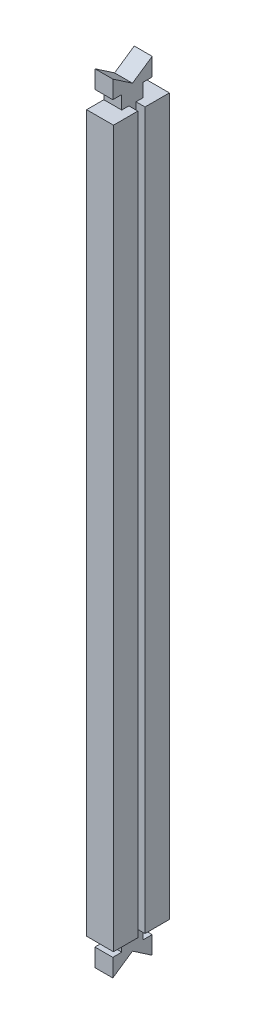
ISO-10303-21;
HEADER;
FILE_DESCRIPTION(('STEP AP214'),'2;1');
FILE_NAME('part.step','',(''),(''),'','','');
FILE_SCHEMA(('AUTOMOTIVE_DESIGN { 1 0 10303 214 1 1 1 1 }'));
ENDSEC;
DATA;
#1=APPLICATION_CONTEXT('core data for automotive mechanical design processes');
#2=APPLICATION_PROTOCOL_DEFINITION('international standard','automotive_design',2000,#1);
#3=PRODUCT_CONTEXT('',#1,'mechanical');
#4=PRODUCT('Part','Part','',(#3));
#5=PRODUCT_RELATED_PRODUCT_CATEGORY('part','',(#4));
#6=PRODUCT_DEFINITION_FORMATION('','',#4);
#7=PRODUCT_DEFINITION_CONTEXT('part definition',#1,'design');
#8=PRODUCT_DEFINITION('design','',#6,#7);
#9=PRODUCT_DEFINITION_SHAPE('','',#8);
#10=(LENGTH_UNIT() NAMED_UNIT(*) SI_UNIT(.MILLI.,.METRE.));
#11=(NAMED_UNIT(*) PLANE_ANGLE_UNIT() SI_UNIT($,.RADIAN.));
#12=(NAMED_UNIT(*) SI_UNIT($,.STERADIAN.) SOLID_ANGLE_UNIT());
#13=UNCERTAINTY_MEASURE_WITH_UNIT(LENGTH_MEASURE(1.E-05),#10,'distance_accuracy_value','');
#14=(GEOMETRIC_REPRESENTATION_CONTEXT(3) GLOBAL_UNCERTAINTY_ASSIGNED_CONTEXT((#13)) GLOBAL_UNIT_ASSIGNED_CONTEXT((#10,
#11,#12)) REPRESENTATION_CONTEXT('',''));
#15=CARTESIAN_POINT('',(0.,0.,0.));
#16=DIRECTION('',(0.,0.,1.));
#17=DIRECTION('',(1.,0.,0.));
#18=AXIS2_PLACEMENT_3D('',#15,#16,#17);
#19=CARTESIAN_POINT('',(0.,0.,0.));
#20=DIRECTION('',(1.,0.,0.));
#21=DIRECTION('',(0.,0.,-1.));
#22=AXIS2_PLACEMENT_3D('',#19,#20,#21);
#23=PLANE('',#22);
#24=DIRECTION('',(0.,0.563336824641511,0.826227342807547));
#25=VECTOR('',#24,1.);
#26=CARTESIAN_POINT('',(0.,6.98500000000001,-5.58799999999999));
#27=LINE('',#26,#25);
#28=CARTESIAN_POINT('',(0.,6.98500000000001,-5.58799999999999));
#29=VERTEX_POINT('',#28);
#30=CARTESIAN_POINT('',(0.,10.795,0.));
#31=VERTEX_POINT('',#30);
#32=EDGE_CURVE('E417',#29,#31,#27,.T.);
#33=ORIENTED_EDGE('',*,*,#32,.T.);
#34=DIRECTION('',(0.,0.563336824641511,-0.826227342807547));
#35=VECTOR('',#34,1.);
#36=CARTESIAN_POINT('',(0.,7.36922425952045,5.02447108603668));
#37=LINE('',#36,#35);
#38=CARTESIAN_POINT('',(0.,6.98500000000001,5.58799999999999));
#39=VERTEX_POINT('',#38);
#40=EDGE_CURVE('E498',#39,#31,#37,.T.);
#41=ORIENTED_EDGE('',*,*,#40,.F.);
#42=DIRECTION('',(0.,-1.,0.));
#43=VECTOR('',#42,1.);
#44=CARTESIAN_POINT('',(0.,0.,5.58799999999999));
#45=LINE('',#44,#43);
#46=CARTESIAN_POINT('',(0.,12.065,5.58799999999999));
#47=VERTEX_POINT('',#46);
#48=EDGE_CURVE('E495',#47,#39,#45,.T.);
#49=ORIENTED_EDGE('',*,*,#48,.F.);
#50=DIRECTION('',(0.,0.,1.));
#51=VECTOR('',#50,1.);
#52=CARTESIAN_POINT('',(0.,12.065,0.));
#53=LINE('',#52,#51);
#54=CARTESIAN_POINT('',(0.,12.065,3.04799999999999));
#55=VERTEX_POINT('',#54);
#56=EDGE_CURVE('E492',#55,#47,#53,.T.);
#57=ORIENTED_EDGE('',*,*,#56,.F.);
#58=DIRECTION('',(0.,-1.,0.));
#59=VECTOR('',#58,1.);
#60=CARTESIAN_POINT('',(0.,0.,3.04799999999999));
#61=LINE('',#60,#59);
#62=CARTESIAN_POINT('',(0.,15.875,3.04799999999999));
#63=VERTEX_POINT('',#62);
#64=EDGE_CURVE('E489',#63,#55,#61,.T.);
#65=ORIENTED_EDGE('',*,*,#64,.F.);
#66=DIRECTION('',(0.,0.,1.));
#67=VECTOR('',#66,1.);
#68=CARTESIAN_POINT('',(0.,15.875,0.));
#69=LINE('',#68,#67);
#70=CARTESIAN_POINT('',(0.,15.875,7.93749999999999));
#71=VERTEX_POINT('',#70);
#72=EDGE_CURVE('E485',#63,#71,#69,.T.);
#73=ORIENTED_EDGE('',*,*,#72,.T.);
#74=DIRECTION('',(0.,1.,0.));
#75=VECTOR('',#74,1.);
#76=CARTESIAN_POINT('',(0.,0.,7.93749999999999));
#77=LINE('',#76,#75);
#78=CARTESIAN_POINT('',(0.,219.075,7.93749999999999));
#79=VERTEX_POINT('',#78);
#80=EDGE_CURVE('E481',#71,#79,#77,.T.);
#81=ORIENTED_EDGE('',*,*,#80,.T.);
#82=DIRECTION('',(0.,0.,1.));
#83=VECTOR('',#82,1.);
#84=CARTESIAN_POINT('',(0.,219.075,-1.24359397238857E-12));
#85=LINE('',#84,#83);
#86=CARTESIAN_POINT('',(0.,219.075,3.04799999999999));
#87=VERTEX_POINT('',#86);
#88=EDGE_CURVE('E477',#87,#79,#85,.T.);
#89=ORIENTED_EDGE('',*,*,#88,.F.);
#90=DIRECTION('',(0.,1.,0.));
#91=VECTOR('',#90,1.);
#92=CARTESIAN_POINT('',(0.,0.,3.04799999999999));
#93=LINE('',#92,#91);
#94=CARTESIAN_POINT('',(0.,222.885,3.04799999999999));
#95=VERTEX_POINT('',#94);
#96=EDGE_CURVE('E473',#87,#95,#93,.T.);
#97=ORIENTED_EDGE('',*,*,#96,.T.);
#98=DIRECTION('',(0.,0.,1.));
#99=VECTOR('',#98,1.);
#100=CARTESIAN_POINT('',(0.,222.885,0.));
#101=LINE('',#100,#99);
#102=CARTESIAN_POINT('',(0.,222.885,5.58799999999999));
#103=VERTEX_POINT('',#102);
#104=EDGE_CURVE('E469',#95,#103,#101,.T.);
#105=ORIENTED_EDGE('',*,*,#104,.T.);
#106=DIRECTION('',(0.,1.,0.));
#107=VECTOR('',#106,1.);
#108=CARTESIAN_POINT('',(0.,0.,5.58799999999999));
#109=LINE('',#108,#107);
#110=CARTESIAN_POINT('',(0.,227.965,5.58799999999999));
#111=VERTEX_POINT('',#110);
#112=EDGE_CURVE('E465',#103,#111,#109,.T.);
#113=ORIENTED_EDGE('',*,*,#112,.T.);
#114=DIRECTION('',(0.,-0.563336824641514,-0.826227342807545));
#115=VECTOR('',#114,1.);
#116=CARTESIAN_POINT('',(0.,153.019774330041,-104.331664315938));
#117=LINE('',#116,#115);
#118=CARTESIAN_POINT('',(0.,224.155,0.));
#119=VERTEX_POINT('',#118);
#120=EDGE_CURVE('E461',#111,#119,#117,.T.);
#121=ORIENTED_EDGE('',*,*,#120,.T.);
#122=DIRECTION('',(0.,-0.563336824641514,0.826227342807545));
#123=VECTOR('',#122,1.);
#124=CARTESIAN_POINT('',(0.,153.019774330041,104.331664315938));
#125=LINE('',#124,#123);
#126=CARTESIAN_POINT('',(0.,227.965,-5.58799999999997));
#127=VERTEX_POINT('',#126);
#128=EDGE_CURVE('E423',#127,#119,#125,.T.);
#129=ORIENTED_EDGE('',*,*,#128,.F.);
#130=DIRECTION('',(0.,1.,0.));
#131=VECTOR('',#130,1.);
#132=CARTESIAN_POINT('',(0.,0.,-5.58799999999999));
#133=LINE('',#132,#131);
#134=CARTESIAN_POINT('',(0.,222.885,-5.58799999999999));
#135=VERTEX_POINT('',#134);
#136=EDGE_CURVE('E516',#135,#127,#133,.T.);
#137=ORIENTED_EDGE('',*,*,#136,.F.);
#138=DIRECTION('',(0.,0.,-1.));
#139=VECTOR('',#138,1.);
#140=CARTESIAN_POINT('',(0.,222.885,0.));
#141=LINE('',#140,#139);
#142=CARTESIAN_POINT('',(0.,222.885,-3.04799999999999));
#143=VERTEX_POINT('',#142);
#144=EDGE_CURVE('E513',#143,#135,#141,.T.);
#145=ORIENTED_EDGE('',*,*,#144,.F.);
#146=DIRECTION('',(0.,1.,0.));
#147=VECTOR('',#146,1.);
#148=CARTESIAN_POINT('',(0.,0.,-3.04799999999999));
#149=LINE('',#148,#147);
#150=CARTESIAN_POINT('',(0.,219.075,-3.04799999999999));
#151=VERTEX_POINT('',#150);
#152=EDGE_CURVE('E510',#151,#143,#149,.T.);
#153=ORIENTED_EDGE('',*,*,#152,.F.);
#154=DIRECTION('',(0.,0.,-1.));
#155=VECTOR('',#154,1.);
#156=CARTESIAN_POINT('',(0.,219.075,1.24359397238857E-12));
#157=LINE('',#156,#155);
#158=CARTESIAN_POINT('',(0.,219.075,-7.93749999999999));
#159=VERTEX_POINT('',#158);
#160=EDGE_CURVE('E506',#151,#159,#157,.T.);
#161=ORIENTED_EDGE('',*,*,#160,.T.);
#162=DIRECTION('',(0.,1.,0.));
#163=VECTOR('',#162,1.);
#164=CARTESIAN_POINT('',(0.,0.,-7.93749999999999));
#165=LINE('',#164,#163);
#166=CARTESIAN_POINT('',(0.,15.875,-7.93749999999999));
#167=VERTEX_POINT('',#166);
#168=EDGE_CURVE('E502',#167,#159,#165,.T.);
#169=ORIENTED_EDGE('',*,*,#168,.F.);
#170=DIRECTION('',(0.,0.,-1.));
#171=VECTOR('',#170,1.);
#172=CARTESIAN_POINT('',(0.,15.875,-3.04799999999999));
#173=LINE('',#172,#171);
#174=CARTESIAN_POINT('',(0.,15.875,-3.04799999999999));
#175=VERTEX_POINT('',#174);
#176=EDGE_CURVE('E579',#175,#167,#173,.T.);
#177=ORIENTED_EDGE('',*,*,#176,.F.);
#178=DIRECTION('',(0.,-1.,0.));
#179=VECTOR('',#178,1.);
#180=CARTESIAN_POINT('',(0.,15.875,-3.04799999999999));
#181=LINE('',#180,#179);
#182=CARTESIAN_POINT('',(0.,12.065,-3.04799999999999));
#183=VERTEX_POINT('',#182);
#184=EDGE_CURVE('E603',#175,#183,#181,.T.);
#185=ORIENTED_EDGE('',*,*,#184,.T.);
#186=DIRECTION('',(0.,0.,-1.));
#187=VECTOR('',#186,1.);
#188=CARTESIAN_POINT('',(0.,12.065,-3.04799999999999));
#189=LINE('',#188,#187);
#190=CARTESIAN_POINT('',(0.,12.065,-5.58799999999999));
#191=VERTEX_POINT('',#190);
#192=EDGE_CURVE('E599',#183,#191,#189,.T.);
#193=ORIENTED_EDGE('',*,*,#192,.T.);
#194=DIRECTION('',(0.,-1.,0.));
#195=VECTOR('',#194,1.);
#196=CARTESIAN_POINT('',(0.,12.065,-5.58799999999999));
#197=LINE('',#196,#195);
#198=EDGE_CURVE('E595',#191,#29,#197,.T.);
#199=ORIENTED_EDGE('',*,*,#198,.T.);
#200=EDGE_LOOP('',(#33,#41,#49,#57,#65,#73,#81,#89,#97,#105,#113,#121,#129,#137,#145,#153,#161,
#169,#177,#185,#193,#199));
#201=FACE_BOUND('',#200,.T.);
#202=ADVANCED_FACE('F170',(#201),#23,.F.);
#203=CARTESIAN_POINT('',(5.08,0.,5.58799999999999));
#204=DIRECTION('',(0.,0.,-1.));
#205=DIRECTION('',(-1.,0.,0.));
#206=AXIS2_PLACEMENT_3D('',#203,#204,#205);
#207=PLANE('',#206);
#208=ORIENTED_EDGE('',*,*,#48,.T.);
#209=DIRECTION('',(-1.,0.,0.));
#210=VECTOR('',#209,1.);
#211=CARTESIAN_POINT('',(5.08,6.98500000000001,5.58799999999999));
#212=LINE('',#211,#210);
#213=CARTESIAN_POINT('',(5.08,6.98500000000001,5.58799999999999));
#214=VERTEX_POINT('',#213);
#215=EDGE_CURVE('E545',#214,#39,#212,.T.);
#216=ORIENTED_EDGE('',*,*,#215,.F.);
#217=DIRECTION('',(0.,-1.,0.));
#218=VECTOR('',#217,1.);
#219=CARTESIAN_POINT('',(5.08,0.,5.58799999999999));
#220=LINE('',#219,#218);
#221=CARTESIAN_POINT('',(5.08,12.065,5.58799999999999));
#222=VERTEX_POINT('',#221);
#223=EDGE_CURVE('E441',#222,#214,#220,.T.);
#224=ORIENTED_EDGE('',*,*,#223,.F.);
#225=DIRECTION('',(-1.,0.,0.));
#226=VECTOR('',#225,1.);
#227=CARTESIAN_POINT('',(5.08,12.065,5.58799999999999));
#228=LINE('',#227,#226);
#229=EDGE_CURVE('E549',#222,#47,#228,.T.);
#230=ORIENTED_EDGE('',*,*,#229,.T.);
#231=EDGE_LOOP('',(#208,#216,#224,#230));
#232=FACE_BOUND('',#231,.T.);
#233=ADVANCED_FACE('F714',(#232),#207,.F.);
#234=CARTESIAN_POINT('',(5.08,12.065,0.));
#235=DIRECTION('',(0.,-1.,0.));
#236=DIRECTION('',(0.,0.,-1.));
#237=AXIS2_PLACEMENT_3D('',#234,#235,#236);
#238=PLANE('',#237);
#239=ORIENTED_EDGE('',*,*,#56,.T.);
#240=ORIENTED_EDGE('',*,*,#229,.F.);
#241=DIRECTION('',(0.,0.,1.));
#242=VECTOR('',#241,1.);
#243=CARTESIAN_POINT('',(5.08,12.065,0.));
#244=LINE('',#243,#242);
#245=CARTESIAN_POINT('',(5.08,12.065,3.04799999999999));
#246=VERTEX_POINT('',#245);
#247=EDGE_CURVE('E438',#246,#222,#244,.T.);
#248=ORIENTED_EDGE('',*,*,#247,.F.);
#249=DIRECTION('',(-1.,0.,0.));
#250=VECTOR('',#249,1.);
#251=CARTESIAN_POINT('',(5.08,12.065,3.04799999999999));
#252=LINE('',#251,#250);
#253=EDGE_CURVE('E553',#246,#55,#252,.T.);
#254=ORIENTED_EDGE('',*,*,#253,.T.);
#255=EDGE_LOOP('',(#239,#240,#248,#254));
#256=FACE_BOUND('',#255,.T.);
#257=ADVANCED_FACE('F709',(#256),#238,.F.);
#258=CARTESIAN_POINT('',(5.08,0.,3.04799999999999));
#259=DIRECTION('',(0.,0.,-1.));
#260=DIRECTION('',(-1.,0.,0.));
#261=AXIS2_PLACEMENT_3D('',#258,#259,#260);
#262=PLANE('',#261);
#263=ORIENTED_EDGE('',*,*,#64,.T.);
#264=ORIENTED_EDGE('',*,*,#253,.F.);
#265=DIRECTION('',(0.,-1.,0.));
#266=VECTOR('',#265,1.);
#267=CARTESIAN_POINT('',(5.08,0.,3.04799999999999));
#268=LINE('',#267,#266);
#269=CARTESIAN_POINT('',(5.08,15.875,3.04799999999999));
#270=VERTEX_POINT('',#269);
#271=EDGE_CURVE('E435',#270,#246,#268,.T.);
#272=ORIENTED_EDGE('',*,*,#271,.F.);
#273=DIRECTION('',(-1.,0.,0.));
#274=VECTOR('',#273,1.);
#275=CARTESIAN_POINT('',(5.08,15.875,3.04799999999999));
#276=LINE('',#275,#274);
#277=EDGE_CURVE('E557',#270,#63,#276,.T.);
#278=ORIENTED_EDGE('',*,*,#277,.T.);
#279=EDGE_LOOP('',(#263,#264,#272,#278));
#280=FACE_BOUND('',#279,.T.);
#281=ADVANCED_FACE('F704',(#280),#262,.F.);
#282=CARTESIAN_POINT('',(5.08,15.875,0.));
#283=DIRECTION('',(0.,-1.,0.));
#284=DIRECTION('',(0.,0.,-1.));
#285=AXIS2_PLACEMENT_3D('',#282,#283,#284);
#286=PLANE('',#285);
#287=ORIENTED_EDGE('',*,*,#72,.F.);
#288=ORIENTED_EDGE('',*,*,#277,.F.);
#289=DIRECTION('',(0.,0.,1.));
#290=VECTOR('',#289,1.);
#291=CARTESIAN_POINT('',(5.08,15.875,0.));
#292=LINE('',#291,#290);
#293=CARTESIAN_POINT('',(5.08,15.875,1.016));
#294=VERTEX_POINT('',#293);
#295=EDGE_CURVE('E354',#294,#270,#292,.T.);
#296=ORIENTED_EDGE('',*,*,#295,.F.);
#297=DIRECTION('',(-1.,0.,0.));
#298=VECTOR('',#297,1.);
#299=CARTESIAN_POINT('',(7.62,15.875,1.016));
#300=LINE('',#299,#298);
#301=CARTESIAN_POINT('',(7.62,15.875,1.016));
#302=VERTEX_POINT('',#301);
#303=EDGE_CURVE('E414',#302,#294,#300,.T.);
#304=ORIENTED_EDGE('',*,*,#303,.F.);
#305=DIRECTION('',(0.,0.,1.));
#306=VECTOR('',#305,1.);
#307=CARTESIAN_POINT('',(7.62,15.875,0.));
#308=LINE('',#307,#306);
#309=CARTESIAN_POINT('',(7.62,15.875,7.93749999999999));
#310=VERTEX_POINT('',#309);
#311=EDGE_CURVE('E390',#302,#310,#308,.T.);
#312=ORIENTED_EDGE('',*,*,#311,.T.);
#313=DIRECTION('',(-1.,0.,0.));
#314=VECTOR('',#313,1.);
#315=CARTESIAN_POINT('',(5.08,15.875,7.93749999999999));
#316=LINE('',#315,#314);
#317=EDGE_CURVE('E560',#310,#71,#316,.T.);
#318=ORIENTED_EDGE('',*,*,#317,.T.);
#319=EDGE_LOOP('',(#287,#288,#296,#304,#312,#318));
#320=FACE_BOUND('',#319,.T.);
#321=ADVANCED_FACE('F702',(#320),#286,.T.);
#322=CARTESIAN_POINT('',(5.08,0.,7.93749999999999));
#323=DIRECTION('',(0.,0.,1.));
#324=DIRECTION('',(1.,0.,0.));
#325=AXIS2_PLACEMENT_3D('',#322,#323,#324);
#326=PLANE('',#325);
#327=ORIENTED_EDGE('',*,*,#80,.F.);
#328=ORIENTED_EDGE('',*,*,#317,.F.);
#329=DIRECTION('',(0.,-1.,0.));
#330=VECTOR('',#329,1.);
#331=CARTESIAN_POINT('',(7.62,0.,7.93749999999999));
#332=LINE('',#331,#330);
#333=CARTESIAN_POINT('',(7.62,219.075,7.93749999999999));
#334=VERTEX_POINT('',#333);
#335=EDGE_CURVE('E386',#334,#310,#332,.T.);
#336=ORIENTED_EDGE('',*,*,#335,.F.);
#337=DIRECTION('',(-1.,0.,0.));
#338=VECTOR('',#337,1.);
#339=CARTESIAN_POINT('',(5.08,219.075,7.93749999999999));
#340=LINE('',#339,#338);
#341=EDGE_CURVE('E563',#334,#79,#340,.T.);
#342=ORIENTED_EDGE('',*,*,#341,.T.);
#343=EDGE_LOOP('',(#327,#328,#336,#342));
#344=FACE_BOUND('',#343,.T.);
#345=ADVANCED_FACE('F687',(#344),#326,.T.);
#346=CARTESIAN_POINT('',(5.08,219.075,-1.24359397238857E-12));
#347=DIRECTION('',(0.,-1.,0.));
#348=DIRECTION('',(0.,0.,-1.));
#349=AXIS2_PLACEMENT_3D('',#346,#347,#348);
#350=PLANE('',#349);
#351=ORIENTED_EDGE('',*,*,#88,.T.);
#352=ORIENTED_EDGE('',*,*,#341,.F.);
#353=DIRECTION('',(0.,0.,1.));
#354=VECTOR('',#353,1.);
#355=CARTESIAN_POINT('',(7.62,219.075,-8.78502163980913E-13));
#356=LINE('',#355,#354);
#357=CARTESIAN_POINT('',(7.62,219.075,1.016));
#358=VERTEX_POINT('',#357);
#359=EDGE_CURVE('E399',#358,#334,#356,.T.);
#360=ORIENTED_EDGE('',*,*,#359,.F.);
#361=DIRECTION('',(-1.,0.,0.));
#362=VECTOR('',#361,1.);
#363=CARTESIAN_POINT('',(7.62,219.075,1.016));
#364=LINE('',#363,#362);
#365=CARTESIAN_POINT('',(5.08,219.075,1.016));
#366=VERTEX_POINT('',#365);
#367=EDGE_CURVE('E403',#358,#366,#364,.T.);
#368=ORIENTED_EDGE('',*,*,#367,.T.);
#369=DIRECTION('',(0.,0.,1.));
#370=VECTOR('',#369,1.);
#371=CARTESIAN_POINT('',(5.08,219.075,-8.78502163980913E-13));
#372=LINE('',#371,#370);
#373=CARTESIAN_POINT('',(5.08,219.075,3.04799999999999));
#374=VERTEX_POINT('',#373);
#375=EDGE_CURVE('E391',#366,#374,#372,.T.);
#376=ORIENTED_EDGE('',*,*,#375,.T.);
#377=DIRECTION('',(-1.,0.,0.));
#378=VECTOR('',#377,1.);
#379=CARTESIAN_POINT('',(5.08,219.075,3.04799999999999));
#380=LINE('',#379,#378);
#381=EDGE_CURVE('E566',#374,#87,#380,.T.);
#382=ORIENTED_EDGE('',*,*,#381,.T.);
#383=EDGE_LOOP('',(#351,#352,#360,#368,#376,#382));
#384=FACE_BOUND('',#383,.T.);
#385=ADVANCED_FACE('F682',(#384),#350,.F.);
#386=CARTESIAN_POINT('',(5.08,0.,3.04799999999999));
#387=DIRECTION('',(0.,0.,1.));
#388=DIRECTION('',(1.,0.,0.));
#389=AXIS2_PLACEMENT_3D('',#386,#387,#388);
#390=PLANE('',#389);
#391=ORIENTED_EDGE('',*,*,#96,.F.);
#392=ORIENTED_EDGE('',*,*,#381,.F.);
#393=DIRECTION('',(0.,1.,0.));
#394=VECTOR('',#393,1.);
#395=CARTESIAN_POINT('',(5.08,0.,3.04799999999999));
#396=LINE('',#395,#394);
#397=CARTESIAN_POINT('',(5.08,222.885,3.04799999999999));
#398=VERTEX_POINT('',#397);
#399=EDGE_CURVE('E431',#374,#398,#396,.T.);
#400=ORIENTED_EDGE('',*,*,#399,.T.);
#401=DIRECTION('',(-1.,0.,0.));
#402=VECTOR('',#401,1.);
#403=CARTESIAN_POINT('',(5.08,222.885,3.04799999999999));
#404=LINE('',#403,#402);
#405=EDGE_CURVE('E569',#398,#95,#404,.T.);
#406=ORIENTED_EDGE('',*,*,#405,.T.);
#407=EDGE_LOOP('',(#391,#392,#400,#406));
#408=FACE_BOUND('',#407,.T.);
#409=ADVANCED_FACE('F679',(#408),#390,.T.);
#410=CARTESIAN_POINT('',(5.08,222.885,0.));
#411=DIRECTION('',(0.,-1.,0.));
#412=DIRECTION('',(0.,0.,-1.));
#413=AXIS2_PLACEMENT_3D('',#410,#411,#412);
#414=PLANE('',#413);
#415=ORIENTED_EDGE('',*,*,#104,.F.);
#416=ORIENTED_EDGE('',*,*,#405,.F.);
#417=DIRECTION('',(0.,0.,1.));
#418=VECTOR('',#417,1.);
#419=CARTESIAN_POINT('',(5.08,222.885,0.));
#420=LINE('',#419,#418);
#421=CARTESIAN_POINT('',(5.08,222.885,5.58799999999999));
#422=VERTEX_POINT('',#421);
#423=EDGE_CURVE('E427',#398,#422,#420,.T.);
#424=ORIENTED_EDGE('',*,*,#423,.T.);
#425=DIRECTION('',(-1.,0.,0.));
#426=VECTOR('',#425,1.);
#427=CARTESIAN_POINT('',(5.08,222.885,5.58799999999999));
#428=LINE('',#427,#426);
#429=EDGE_CURVE('E180',#422,#103,#428,.T.);
#430=ORIENTED_EDGE('',*,*,#429,.T.);
#431=EDGE_LOOP('',(#415,#416,#424,#430));
#432=FACE_BOUND('',#431,.T.);
#433=ADVANCED_FACE('F673',(#432),#414,.T.);
#434=CARTESIAN_POINT('',(5.08,0.,5.58799999999999));
#435=DIRECTION('',(0.,0.,1.));
#436=DIRECTION('',(1.,0.,0.));
#437=AXIS2_PLACEMENT_3D('',#434,#435,#436);
#438=PLANE('',#437);
#439=ORIENTED_EDGE('',*,*,#112,.F.);
#440=ORIENTED_EDGE('',*,*,#429,.F.);
#441=DIRECTION('',(0.,1.,0.));
#442=VECTOR('',#441,1.);
#443=CARTESIAN_POINT('',(5.08,0.,5.58799999999999));
#444=LINE('',#443,#442);
#445=CARTESIAN_POINT('',(5.08,227.965,5.58799999999999));
#446=VERTEX_POINT('',#445);
#447=EDGE_CURVE('E422',#422,#446,#444,.T.);
#448=ORIENTED_EDGE('',*,*,#447,.T.);
#449=DIRECTION('',(-1.,0.,0.));
#450=VECTOR('',#449,1.);
#451=CARTESIAN_POINT('',(5.08,227.965,5.58799999999999));
#452=LINE('',#451,#450);
#453=EDGE_CURVE('E12',#446,#111,#452,.T.);
#454=ORIENTED_EDGE('',*,*,#453,.T.);
#455=EDGE_LOOP('',(#439,#440,#448,#454));
#456=FACE_BOUND('',#455,.T.);
#457=ADVANCED_FACE('F669',(#456),#438,.T.);
#458=CARTESIAN_POINT('',(5.08,153.019774330041,-104.331664315938));
#459=DIRECTION('',(0.,0.826227342807545,-0.563336824641514));
#460=DIRECTION('',(0.,0.563336824641514,0.826227342807545));
#461=AXIS2_PLACEMENT_3D('',#458,#459,#460);
#462=PLANE('',#461);
#463=ORIENTED_EDGE('',*,*,#120,.F.);
#464=ORIENTED_EDGE('',*,*,#453,.F.);
#465=DIRECTION('',(0.,-0.563336824641514,-0.826227342807545));
#466=VECTOR('',#465,1.);
#467=CARTESIAN_POINT('',(5.08,153.019774330041,-104.331664315938));
#468=LINE('',#467,#466);
#469=CARTESIAN_POINT('',(5.08,224.155,0.));
#470=VERTEX_POINT('',#469);
#471=EDGE_CURVE('E418',#446,#470,#468,.T.);
#472=ORIENTED_EDGE('',*,*,#471,.T.);
#473=DIRECTION('',(-1.,0.,0.));
#474=VECTOR('',#473,1.);
#475=CARTESIAN_POINT('',(5.08,224.155,0.));
#476=LINE('',#475,#474);
#477=EDGE_CURVE('E460',#470,#119,#476,.T.);
#478=ORIENTED_EDGE('',*,*,#477,.T.);
#479=EDGE_LOOP('',(#463,#464,#472,#478));
#480=FACE_BOUND('',#479,.T.);
#481=ADVANCED_FACE('F751',(#480),#462,.T.);
#482=CARTESIAN_POINT('',(5.08,153.019774330041,104.331664315938));
#483=DIRECTION('',(0.,-0.826227342807545,-0.563336824641514));
#484=DIRECTION('',(0.,0.563336824641514,-0.826227342807545));
#485=AXIS2_PLACEMENT_3D('',#482,#483,#484);
#486=PLANE('',#485);
#487=ORIENTED_EDGE('',*,*,#128,.T.);
#488=ORIENTED_EDGE('',*,*,#477,.F.);
#489=DIRECTION('',(0.,-0.563336824641514,0.826227342807545));
#490=VECTOR('',#489,1.);
#491=CARTESIAN_POINT('',(5.08,153.019774330041,104.331664315938));
#492=LINE('',#491,#490);
#493=CARTESIAN_POINT('',(5.08,227.965,-5.58799999999997));
#494=VERTEX_POINT('',#493);
#495=EDGE_CURVE('E457',#494,#470,#492,.T.);
#496=ORIENTED_EDGE('',*,*,#495,.F.);
#497=DIRECTION('',(-1.,0.,0.));
#498=VECTOR('',#497,1.);
#499=CARTESIAN_POINT('',(5.08,227.965,-5.58799999999997));
#500=LINE('',#499,#498);
#501=EDGE_CURVE('E524',#494,#127,#500,.T.);
#502=ORIENTED_EDGE('',*,*,#501,.T.);
#503=EDGE_LOOP('',(#487,#488,#496,#502));
#504=FACE_BOUND('',#503,.T.);
#505=ADVANCED_FACE('F662',(#504),#486,.F.);
#506=CARTESIAN_POINT('',(5.08,0.,-5.58799999999999));
#507=DIRECTION('',(0.,0.,1.));
#508=DIRECTION('',(1.,0.,0.));
#509=AXIS2_PLACEMENT_3D('',#506,#507,#508);
#510=PLANE('',#509);
#511=ORIENTED_EDGE('',*,*,#136,.T.);
#512=ORIENTED_EDGE('',*,*,#501,.F.);
#513=DIRECTION('',(0.,1.,0.));
#514=VECTOR('',#513,1.);
#515=CARTESIAN_POINT('',(5.08,0.,-5.58799999999999));
#516=LINE('',#515,#514);
#517=CARTESIAN_POINT('',(5.08,222.885,-5.58799999999999));
#518=VERTEX_POINT('',#517);
#519=EDGE_CURVE('E454',#518,#494,#516,.T.);
#520=ORIENTED_EDGE('',*,*,#519,.F.);
#521=DIRECTION('',(-1.,0.,0.));
#522=VECTOR('',#521,1.);
#523=CARTESIAN_POINT('',(5.08,222.885,-5.58799999999999));
#524=LINE('',#523,#522);
#525=EDGE_CURVE('E528',#518,#135,#524,.T.);
#526=ORIENTED_EDGE('',*,*,#525,.T.);
#527=EDGE_LOOP('',(#511,#512,#520,#526));
#528=FACE_BOUND('',#527,.T.);
#529=ADVANCED_FACE('F657',(#528),#510,.F.);
#530=CARTESIAN_POINT('',(5.08,222.885,0.));
#531=DIRECTION('',(0.,1.,0.));
#532=DIRECTION('',(0.,0.,1.));
#533=AXIS2_PLACEMENT_3D('',#530,#531,#532);
#534=PLANE('',#533);
#535=ORIENTED_EDGE('',*,*,#144,.T.);
#536=ORIENTED_EDGE('',*,*,#525,.F.);
#537=DIRECTION('',(0.,0.,-1.));
#538=VECTOR('',#537,1.);
#539=CARTESIAN_POINT('',(5.08,222.885,0.));
#540=LINE('',#539,#538);
#541=CARTESIAN_POINT('',(5.08,222.885,-3.04799999999999));
#542=VERTEX_POINT('',#541);
#543=EDGE_CURVE('E451',#542,#518,#540,.T.);
#544=ORIENTED_EDGE('',*,*,#543,.F.);
#545=DIRECTION('',(-1.,0.,0.));
#546=VECTOR('',#545,1.);
#547=CARTESIAN_POINT('',(5.08,222.885,-3.04799999999999));
#548=LINE('',#547,#546);
#549=EDGE_CURVE('E532',#542,#143,#548,.T.);
#550=ORIENTED_EDGE('',*,*,#549,.T.);
#551=EDGE_LOOP('',(#535,#536,#544,#550));
#552=FACE_BOUND('',#551,.T.);
#553=ADVANCED_FACE('F653',(#552),#534,.F.);
#554=CARTESIAN_POINT('',(5.08,0.,-3.04799999999999));
#555=DIRECTION('',(0.,0.,1.));
#556=DIRECTION('',(1.,0.,0.));
#557=AXIS2_PLACEMENT_3D('',#554,#555,#556);
#558=PLANE('',#557);
#559=ORIENTED_EDGE('',*,*,#152,.T.);
#560=ORIENTED_EDGE('',*,*,#549,.F.);
#561=DIRECTION('',(0.,1.,0.));
#562=VECTOR('',#561,1.);
#563=CARTESIAN_POINT('',(5.08,0.,-3.04799999999999));
#564=LINE('',#563,#562);
#565=CARTESIAN_POINT('',(5.08,219.075,-3.04799999999999));
#566=VERTEX_POINT('',#565);
#567=EDGE_CURVE('E448',#566,#542,#564,.T.);
#568=ORIENTED_EDGE('',*,*,#567,.F.);
#569=DIRECTION('',(-1.,0.,0.));
#570=VECTOR('',#569,1.);
#571=CARTESIAN_POINT('',(5.08,219.075,-3.04799999999999));
#572=LINE('',#571,#570);
#573=EDGE_CURVE('E536',#566,#151,#572,.T.);
#574=ORIENTED_EDGE('',*,*,#573,.T.);
#575=EDGE_LOOP('',(#559,#560,#568,#574));
#576=FACE_BOUND('',#575,.T.);
#577=ADVANCED_FACE('F647',(#576),#558,.F.);
#578=CARTESIAN_POINT('',(5.08,219.075,1.24359397238857E-12));
#579=DIRECTION('',(0.,1.,0.));
#580=DIRECTION('',(0.,0.,1.));
#581=AXIS2_PLACEMENT_3D('',#578,#579,#580);
#582=PLANE('',#581);
#583=ORIENTED_EDGE('',*,*,#160,.F.);
#584=ORIENTED_EDGE('',*,*,#573,.F.);
#585=DIRECTION('',(0.,0.,-1.));
#586=VECTOR('',#585,1.);
#587=CARTESIAN_POINT('',(5.08,219.075,8.78502163980913E-13));
#588=LINE('',#587,#586);
#589=CARTESIAN_POINT('',(5.08,219.075,-1.016));
#590=VERTEX_POINT('',#589);
#591=EDGE_CURVE('E351',#590,#566,#588,.T.);
#592=ORIENTED_EDGE('',*,*,#591,.F.);
#593=DIRECTION('',(-1.,0.,0.));
#594=VECTOR('',#593,1.);
#595=CARTESIAN_POINT('',(7.62,219.075,-1.016));
#596=LINE('',#595,#594);
#597=CARTESIAN_POINT('',(7.62,219.075,-1.016));
#598=VERTEX_POINT('',#597);
#599=EDGE_CURVE('E344',#598,#590,#596,.T.);
#600=ORIENTED_EDGE('',*,*,#599,.F.);
#601=DIRECTION('',(0.,0.,-1.));
#602=VECTOR('',#601,1.);
#603=CARTESIAN_POINT('',(7.62,219.075,8.78502163980913E-13));
#604=LINE('',#603,#602);
#605=CARTESIAN_POINT('',(7.62,219.075,-7.93749999999999));
#606=VERTEX_POINT('',#605);
#607=EDGE_CURVE('E349',#598,#606,#604,.T.);
#608=ORIENTED_EDGE('',*,*,#607,.T.);
#609=DIRECTION('',(-1.,0.,0.));
#610=VECTOR('',#609,1.);
#611=CARTESIAN_POINT('',(5.08,219.075,-7.93749999999999));
#612=LINE('',#611,#610);
#613=EDGE_CURVE('E539',#606,#159,#612,.T.);
#614=ORIENTED_EDGE('',*,*,#613,.T.);
#615=EDGE_LOOP('',(#583,#584,#592,#600,#608,#614));
#616=FACE_BOUND('',#615,.T.);
#617=ADVANCED_FACE('F347',(#616),#582,.T.);
#618=CARTESIAN_POINT('',(5.08,0.,-7.93749999999999));
#619=DIRECTION('',(0.,0.,1.));
#620=DIRECTION('',(1.,0.,0.));
#621=AXIS2_PLACEMENT_3D('',#618,#619,#620);
#622=PLANE('',#621);
#623=ORIENTED_EDGE('',*,*,#168,.T.);
#624=ORIENTED_EDGE('',*,*,#613,.F.);
#625=DIRECTION('',(0.,1.,0.));
#626=VECTOR('',#625,1.);
#627=CARTESIAN_POINT('',(7.62,0.,-7.93749999999999));
#628=LINE('',#627,#626);
#629=CARTESIAN_POINT('',(7.62,15.875,-7.93749999999999));
#630=VERTEX_POINT('',#629);
#631=EDGE_CURVE('E370',#630,#606,#628,.T.);
#632=ORIENTED_EDGE('',*,*,#631,.F.);
#633=DIRECTION('',(-1.,0.,0.));
#634=VECTOR('',#633,1.);
#635=CARTESIAN_POINT('',(5.08,15.875,-7.93749999999999));
#636=LINE('',#635,#634);
#637=EDGE_CURVE('E591',#630,#167,#636,.T.);
#638=ORIENTED_EDGE('',*,*,#637,.T.);
#639=EDGE_LOOP('',(#623,#624,#632,#638));
#640=FACE_BOUND('',#639,.T.);
#641=ADVANCED_FACE('F643',(#640),#622,.F.);
#642=CARTESIAN_POINT('',(5.08,7.36922425952045,5.02447108603668));
#643=DIRECTION('',(0.,0.826227342807547,0.563336824641511));
#644=DIRECTION('',(0.,-0.563336824641511,0.826227342807547));
#645=AXIS2_PLACEMENT_3D('',#642,#643,#644);
#646=PLANE('',#645);
#647=ORIENTED_EDGE('',*,*,#40,.T.);
#648=DIRECTION('',(-1.,0.,0.));
#649=VECTOR('',#648,1.);
#650=CARTESIAN_POINT('',(5.08,10.795,0.));
#651=LINE('',#650,#649);
#652=CARTESIAN_POINT('',(5.08,10.795,0.));
#653=VERTEX_POINT('',#652);
#654=EDGE_CURVE('E542',#653,#31,#651,.T.);
#655=ORIENTED_EDGE('',*,*,#654,.F.);
#656=DIRECTION('',(0.,0.563336824641511,-0.826227342807547));
#657=VECTOR('',#656,1.);
#658=CARTESIAN_POINT('',(5.08,7.36922425952045,5.02447108603668));
#659=LINE('',#658,#657);
#660=EDGE_CURVE('E444',#214,#653,#659,.T.);
#661=ORIENTED_EDGE('',*,*,#660,.F.);
#662=ORIENTED_EDGE('',*,*,#215,.T.);
#663=EDGE_LOOP('',(#647,#655,#661,#662));
#664=FACE_BOUND('',#663,.T.);
#665=ADVANCED_FACE('F717',(#664),#646,.F.);
#666=CARTESIAN_POINT('',(5.08,0.,0.));
#667=DIRECTION('',(1.,0.,0.));
#668=DIRECTION('',(0.,0.,-1.));
#669=AXIS2_PLACEMENT_3D('',#666,#667,#668);
#670=PLANE('',#669);
#671=ORIENTED_EDGE('',*,*,#591,.T.);
#672=ORIENTED_EDGE('',*,*,#567,.T.);
#673=ORIENTED_EDGE('',*,*,#543,.T.);
#674=ORIENTED_EDGE('',*,*,#519,.T.);
#675=ORIENTED_EDGE('',*,*,#495,.T.);
#676=ORIENTED_EDGE('',*,*,#471,.F.);
#677=ORIENTED_EDGE('',*,*,#447,.F.);
#678=ORIENTED_EDGE('',*,*,#423,.F.);
#679=ORIENTED_EDGE('',*,*,#399,.F.);
#680=ORIENTED_EDGE('',*,*,#375,.F.);
#681=DIRECTION('',(0.,-1.,0.));
#682=VECTOR('',#681,1.);
#683=CARTESIAN_POINT('',(5.08,0.,1.01599999999997));
#684=LINE('',#683,#682);
#685=EDGE_CURVE('E406',#366,#294,#684,.T.);
#686=ORIENTED_EDGE('',*,*,#685,.T.);
#687=ORIENTED_EDGE('',*,*,#295,.T.);
#688=ORIENTED_EDGE('',*,*,#271,.T.);
#689=ORIENTED_EDGE('',*,*,#247,.T.);
#690=ORIENTED_EDGE('',*,*,#223,.T.);
#691=ORIENTED_EDGE('',*,*,#660,.T.);
#692=DIRECTION('',(0.,0.563336824641511,0.826227342807547));
#693=VECTOR('',#692,1.);
#694=CARTESIAN_POINT('',(5.08,6.98500000000001,-5.58799999999999));
#695=LINE('',#694,#693);
#696=CARTESIAN_POINT('',(5.08,6.98500000000001,-5.58799999999999));
#697=VERTEX_POINT('',#696);
#698=EDGE_CURVE('E574',#697,#653,#695,.T.);
#699=ORIENTED_EDGE('',*,*,#698,.F.);
#700=DIRECTION('',(0.,-1.,0.));
#701=VECTOR('',#700,1.);
#702=CARTESIAN_POINT('',(5.08,12.065,-5.58799999999999));
#703=LINE('',#702,#701);
#704=CARTESIAN_POINT('',(5.08,12.065,-5.58799999999999));
#705=VERTEX_POINT('',#704);
#706=EDGE_CURVE('E578',#705,#697,#703,.T.);
#707=ORIENTED_EDGE('',*,*,#706,.F.);
#708=DIRECTION('',(0.,0.,-1.));
#709=VECTOR('',#708,1.);
#710=CARTESIAN_POINT('',(5.08,12.065,-3.04799999999999));
#711=LINE('',#710,#709);
#712=CARTESIAN_POINT('',(5.08,12.065,-3.04799999999999));
#713=VERTEX_POINT('',#712);
#714=EDGE_CURVE('E583',#713,#705,#711,.T.);
#715=ORIENTED_EDGE('',*,*,#714,.F.);
#716=DIRECTION('',(0.,-1.,0.));
#717=VECTOR('',#716,1.);
#718=CARTESIAN_POINT('',(5.08,15.875,-3.04799999999999));
#719=LINE('',#718,#717);
#720=CARTESIAN_POINT('',(5.08,15.875,-3.04799999999999));
#721=VERTEX_POINT('',#720);
#722=EDGE_CURVE('E587',#721,#713,#719,.T.);
#723=ORIENTED_EDGE('',*,*,#722,.F.);
#724=DIRECTION('',(0.,0.,-1.));
#725=VECTOR('',#724,1.);
#726=CARTESIAN_POINT('',(5.08,15.875,0.));
#727=LINE('',#726,#725);
#728=CARTESIAN_POINT('',(5.08,15.875,-1.016));
#729=VERTEX_POINT('',#728);
#730=EDGE_CURVE('E193',#729,#721,#727,.T.);
#731=ORIENTED_EDGE('',*,*,#730,.F.);
#732=DIRECTION('',(0.,-1.,0.));
#733=VECTOR('',#732,1.);
#734=CARTESIAN_POINT('',(5.08,0.,-1.01599999999997));
#735=LINE('',#734,#733);
#736=EDGE_CURVE('E188',#590,#729,#735,.T.);
#737=ORIENTED_EDGE('',*,*,#736,.F.);
#738=EDGE_LOOP('',(#671,#672,#673,#674,#675,#676,#677,#678,#679,#680,#686,#687,#688,#689,#690,
#691,#699,#707,#715,#723,#731,#737));
#739=FACE_BOUND('',#738,.T.);
#740=ADVANCED_FACE('F637',(#739),#670,.T.);
#741=CARTESIAN_POINT('',(5.08,6.98500000000001,-5.58799999999999));
#742=DIRECTION('',(0.,-0.826227342807547,0.563336824641511));
#743=DIRECTION('',(0.,-0.563336824641511,-0.826227342807547));
#744=AXIS2_PLACEMENT_3D('',#741,#742,#743);
#745=PLANE('',#744);
#746=ORIENTED_EDGE('',*,*,#32,.F.);
#747=DIRECTION('',(-1.,0.,0.));
#748=VECTOR('',#747,1.);
#749=CARTESIAN_POINT('',(5.08,6.98500000000001,-5.58799999999999));
#750=LINE('',#749,#748);
#751=EDGE_CURVE('E174',#697,#29,#750,.T.);
#752=ORIENTED_EDGE('',*,*,#751,.F.);
#753=ORIENTED_EDGE('',*,*,#698,.T.);
#754=ORIENTED_EDGE('',*,*,#654,.T.);
#755=EDGE_LOOP('',(#746,#752,#753,#754));
#756=FACE_BOUND('',#755,.T.);
#757=ADVANCED_FACE('F172',(#756),#745,.T.);
#758=CARTESIAN_POINT('',(5.08,12.065,-5.58799999999999));
#759=DIRECTION('',(0.,0.,-1.));
#760=DIRECTION('',(-1.,0.,0.));
#761=AXIS2_PLACEMENT_3D('',#758,#759,#760);
#762=PLANE('',#761);
#763=ORIENTED_EDGE('',*,*,#198,.F.);
#764=DIRECTION('',(-1.,0.,0.));
#765=VECTOR('',#764,1.);
#766=CARTESIAN_POINT('',(5.08,12.065,-5.58799999999999));
#767=LINE('',#766,#765);
#768=EDGE_CURVE('E618',#705,#191,#767,.T.);
#769=ORIENTED_EDGE('',*,*,#768,.F.);
#770=ORIENTED_EDGE('',*,*,#706,.T.);
#771=ORIENTED_EDGE('',*,*,#751,.T.);
#772=EDGE_LOOP('',(#763,#769,#770,#771));
#773=FACE_BOUND('',#772,.T.);
#774=ADVANCED_FACE('F626',(#773),#762,.T.);
#775=CARTESIAN_POINT('',(5.08,12.065,-3.04799999999999));
#776=DIRECTION('',(0.,1.,0.));
#777=DIRECTION('',(0.,0.,1.));
#778=AXIS2_PLACEMENT_3D('',#775,#776,#777);
#779=PLANE('',#778);
#780=ORIENTED_EDGE('',*,*,#192,.F.);
#781=DIRECTION('',(-1.,0.,0.));
#782=VECTOR('',#781,1.);
#783=CARTESIAN_POINT('',(5.08,12.065,-3.04799999999999));
#784=LINE('',#783,#782);
#785=EDGE_CURVE('E616',#713,#183,#784,.T.);
#786=ORIENTED_EDGE('',*,*,#785,.F.);
#787=ORIENTED_EDGE('',*,*,#714,.T.);
#788=ORIENTED_EDGE('',*,*,#768,.T.);
#789=EDGE_LOOP('',(#780,#786,#787,#788));
#790=FACE_BOUND('',#789,.T.);
#791=ADVANCED_FACE('F634',(#790),#779,.T.);
#792=CARTESIAN_POINT('',(5.08,15.875,-3.04799999999999));
#793=DIRECTION('',(0.,0.,-1.));
#794=DIRECTION('',(-1.,0.,0.));
#795=AXIS2_PLACEMENT_3D('',#792,#793,#794);
#796=PLANE('',#795);
#797=ORIENTED_EDGE('',*,*,#184,.F.);
#798=DIRECTION('',(-1.,0.,0.));
#799=VECTOR('',#798,1.);
#800=CARTESIAN_POINT('',(5.08,15.875,-3.04799999999999));
#801=LINE('',#800,#799);
#802=EDGE_CURVE('E613',#721,#175,#801,.T.);
#803=ORIENTED_EDGE('',*,*,#802,.F.);
#804=ORIENTED_EDGE('',*,*,#722,.T.);
#805=ORIENTED_EDGE('',*,*,#785,.T.);
#806=EDGE_LOOP('',(#797,#803,#804,#805));
#807=FACE_BOUND('',#806,.T.);
#808=ADVANCED_FACE('F638',(#807),#796,.T.);
#809=CARTESIAN_POINT('',(5.08,15.875,-3.04799999999999));
#810=DIRECTION('',(0.,1.,0.));
#811=DIRECTION('',(0.,0.,1.));
#812=AXIS2_PLACEMENT_3D('',#809,#810,#811);
#813=PLANE('',#812);
#814=ORIENTED_EDGE('',*,*,#176,.T.);
#815=ORIENTED_EDGE('',*,*,#637,.F.);
#816=DIRECTION('',(0.,0.,-1.));
#817=VECTOR('',#816,1.);
#818=CARTESIAN_POINT('',(7.62,15.875,0.));
#819=LINE('',#818,#817);
#820=CARTESIAN_POINT('',(7.62,15.875,-1.016));
#821=VERTEX_POINT('',#820);
#822=EDGE_CURVE('E365',#821,#630,#819,.T.);
#823=ORIENTED_EDGE('',*,*,#822,.F.);
#824=DIRECTION('',(-1.,0.,0.));
#825=VECTOR('',#824,1.);
#826=CARTESIAN_POINT('',(7.62,15.875,-1.016));
#827=LINE('',#826,#825);
#828=EDGE_CURVE('E355',#821,#729,#827,.T.);
#829=ORIENTED_EDGE('',*,*,#828,.T.);
#830=ORIENTED_EDGE('',*,*,#730,.T.);
#831=ORIENTED_EDGE('',*,*,#802,.T.);
#832=EDGE_LOOP('',(#814,#815,#823,#829,#830,#831));
#833=FACE_BOUND('',#832,.T.);
#834=ADVANCED_FACE('F640',(#833),#813,.F.);
#835=CARTESIAN_POINT('',(7.62,0.,1.01599999999997));
#836=DIRECTION('',(0.,0.,-1.));
#837=DIRECTION('',(0.,1.,0.));
#838=AXIS2_PLACEMENT_3D('',#835,#836,#837);
#839=PLANE('',#838);
#840=ORIENTED_EDGE('',*,*,#685,.F.);
#841=ORIENTED_EDGE('',*,*,#367,.F.);
#842=DIRECTION('',(0.,-1.,0.));
#843=VECTOR('',#842,1.);
#844=CARTESIAN_POINT('',(7.62,0.,1.01599999999997));
#845=LINE('',#844,#843);
#846=EDGE_CURVE('E395',#358,#302,#845,.T.);
#847=ORIENTED_EDGE('',*,*,#846,.T.);
#848=ORIENTED_EDGE('',*,*,#303,.T.);
#849=EDGE_LOOP('',(#840,#841,#847,#848));
#850=FACE_BOUND('',#849,.T.);
#851=ADVANCED_FACE('F696',(#850),#839,.T.);
#852=CARTESIAN_POINT('',(7.62,0.,0.));
#853=DIRECTION('',(1.,0.,0.));
#854=DIRECTION('',(0.,0.,-1.));
#855=AXIS2_PLACEMENT_3D('',#852,#853,#854);
#856=PLANE('',#855);
#857=ORIENTED_EDGE('',*,*,#335,.T.);
#858=ORIENTED_EDGE('',*,*,#311,.F.);
#859=ORIENTED_EDGE('',*,*,#846,.F.);
#860=ORIENTED_EDGE('',*,*,#359,.T.);
#861=EDGE_LOOP('',(#857,#858,#859,#860));
#862=FACE_BOUND('',#861,.T.);
#863=ADVANCED_FACE('F692',(#862),#856,.T.);
#864=CARTESIAN_POINT('',(7.62,0.,-1.01599999999997));
#865=DIRECTION('',(0.,0.,-1.));
#866=DIRECTION('',(0.,1.,0.));
#867=AXIS2_PLACEMENT_3D('',#864,#865,#866);
#868=PLANE('',#867);
#869=ORIENTED_EDGE('',*,*,#736,.T.);
#870=ORIENTED_EDGE('',*,*,#828,.F.);
#871=DIRECTION('',(0.,-1.,0.));
#872=VECTOR('',#871,1.);
#873=CARTESIAN_POINT('',(7.62,0.,-1.01599999999997));
#874=LINE('',#873,#872);
#875=EDGE_CURVE('E358',#598,#821,#874,.T.);
#876=ORIENTED_EDGE('',*,*,#875,.F.);
#877=ORIENTED_EDGE('',*,*,#599,.T.);
#878=EDGE_LOOP('',(#869,#870,#876,#877));
#879=FACE_BOUND('',#878,.T.);
#880=ADVANCED_FACE('F359',(#879),#868,.F.);
#881=CARTESIAN_POINT('',(7.62,0.,0.));
#882=DIRECTION('',(1.,0.,0.));
#883=DIRECTION('',(0.,0.,-1.));
#884=AXIS2_PLACEMENT_3D('',#881,#882,#883);
#885=PLANE('',#884);
#886=ORIENTED_EDGE('',*,*,#607,.F.);
#887=ORIENTED_EDGE('',*,*,#875,.T.);
#888=ORIENTED_EDGE('',*,*,#822,.T.);
#889=ORIENTED_EDGE('',*,*,#631,.T.);
#890=EDGE_LOOP('',(#886,#887,#888,#889));
#891=FACE_BOUND('',#890,.T.);
#892=ADVANCED_FACE('F368',(#891),#885,.T.);
#893=CLOSED_SHELL('',(#202,#233,#257,#281,#321,#345,#385,#409,#433,#457,#481,#505,#529,#553,
#577,#617,#641,#665,#740,#757,#774,#791,#808,#834,#851,#863,#880,#892));
#894=MANIFOLD_SOLID_BREP('B2',#893);
#895=ADVANCED_BREP_SHAPE_REPRESENTATION('',(#18,#894),#14);
#896=SHAPE_DEFINITION_REPRESENTATION(#9,#895);
ENDSEC;
END-ISO-10303-21;
